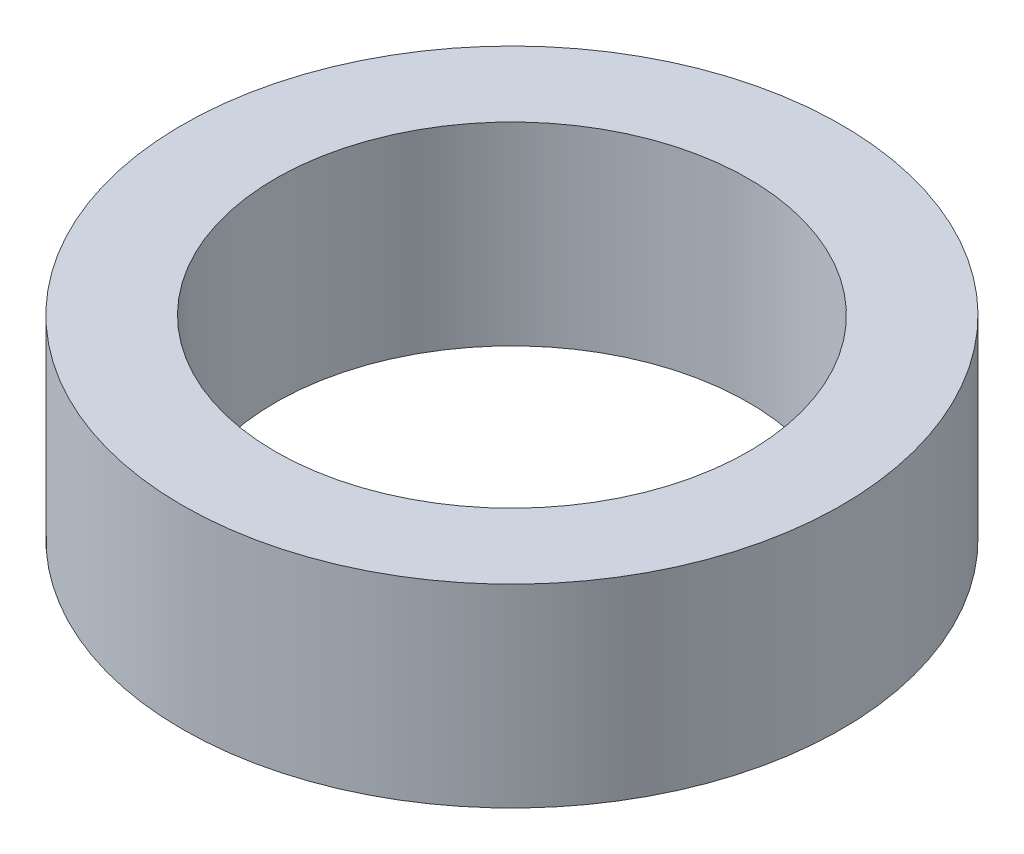
ISO-10303-21;
HEADER;
FILE_DESCRIPTION(('STEP AP214'),'2;1');
FILE_NAME('part.step','',(''),(''),'','','');
FILE_SCHEMA(('AUTOMOTIVE_DESIGN { 1 0 10303 214 1 1 1 1 }'));
ENDSEC;
DATA;
#1=APPLICATION_CONTEXT('core data for automotive mechanical design processes');
#2=APPLICATION_PROTOCOL_DEFINITION('international standard','automotive_design',2000,#1);
#3=PRODUCT_CONTEXT('',#1,'mechanical');
#4=PRODUCT('Part','Part','',(#3));
#5=PRODUCT_RELATED_PRODUCT_CATEGORY('part','',(#4));
#6=PRODUCT_DEFINITION_FORMATION('','',#4);
#7=PRODUCT_DEFINITION_CONTEXT('part definition',#1,'design');
#8=PRODUCT_DEFINITION('design','',#6,#7);
#9=PRODUCT_DEFINITION_SHAPE('','',#8);
#10=(LENGTH_UNIT() NAMED_UNIT(*) SI_UNIT(.MILLI.,.METRE.));
#11=(NAMED_UNIT(*) PLANE_ANGLE_UNIT() SI_UNIT($,.RADIAN.));
#12=(NAMED_UNIT(*) SI_UNIT($,.STERADIAN.) SOLID_ANGLE_UNIT());
#13=UNCERTAINTY_MEASURE_WITH_UNIT(LENGTH_MEASURE(1.E-05),#10,'distance_accuracy_value','');
#14=(GEOMETRIC_REPRESENTATION_CONTEXT(3) GLOBAL_UNCERTAINTY_ASSIGNED_CONTEXT((#13)) GLOBAL_UNIT_ASSIGNED_CONTEXT((#10,
#11,#12)) REPRESENTATION_CONTEXT('',''));
#15=CARTESIAN_POINT('',(0.,0.,0.));
#16=DIRECTION('',(0.,0.,1.));
#17=DIRECTION('',(1.,0.,0.));
#18=AXIS2_PLACEMENT_3D('',#15,#16,#17);
#19=CARTESIAN_POINT('',(-56.2916512459885,-144.,0.));
#20=DIRECTION('',(0.,1.,0.));
#21=DIRECTION('',(0.,0.,1.));
#22=AXIS2_PLACEMENT_3D('',#19,#20,#21);
#23=PLANE('',#22);
#24=CARTESIAN_POINT('',(-56.2916512459885,-144.,0.));
#25=DIRECTION('',(0.,1.,0.));
#26=DIRECTION('',(0.,0.,1.));
#27=AXIS2_PLACEMENT_3D('',#24,#25,#26);
#28=CIRCLE('',#27,8.5);
#29=CARTESIAN_POINT('',(-56.2916512459885,-144.,8.5));
#30=VERTEX_POINT('',#29);
#31=EDGE_CURVE('E10',#30,#30,#28,.T.);
#32=ORIENTED_EDGE('',*,*,#31,.T.);
#33=EDGE_LOOP('',(#32));
#34=FACE_BOUND('',#33,.T.);
#35=CARTESIAN_POINT('',(-56.2916512459885,-144.,0.));
#36=DIRECTION('',(0.,1.,0.));
#37=DIRECTION('',(0.,0.,1.));
#38=AXIS2_PLACEMENT_3D('',#35,#36,#37);
#39=CIRCLE('',#38,6.1);
#40=CARTESIAN_POINT('',(-56.2916512459885,-144.,6.1));
#41=VERTEX_POINT('',#40);
#42=EDGE_CURVE('E49',#41,#41,#39,.T.);
#43=ORIENTED_EDGE('',*,*,#42,.F.);
#44=EDGE_LOOP('',(#43));
#45=FACE_BOUND('',#44,.T.);
#46=ADVANCED_FACE('F39',(#34,#45),#23,.T.);
#47=CARTESIAN_POINT('',(-56.2916512459885,-149.,0.));
#48=DIRECTION('',(0.,1.,0.));
#49=DIRECTION('',(0.,0.,1.));
#50=AXIS2_PLACEMENT_3D('',#47,#48,#49);
#51=PLANE('',#50);
#52=CARTESIAN_POINT('',(-56.2916512459885,-149.,0.));
#53=DIRECTION('',(0.,1.,0.));
#54=DIRECTION('',(0.,0.,1.));
#55=AXIS2_PLACEMENT_3D('',#52,#53,#54);
#56=CIRCLE('',#55,8.5);
#57=CARTESIAN_POINT('',(-56.2916512459885,-149.,8.5));
#58=VERTEX_POINT('',#57);
#59=EDGE_CURVE('E43',#58,#58,#56,.T.);
#60=ORIENTED_EDGE('',*,*,#59,.F.);
#61=EDGE_LOOP('',(#60));
#62=FACE_BOUND('',#61,.T.);
#63=CARTESIAN_POINT('',(-56.2916512459885,-149.,0.));
#64=DIRECTION('',(0.,1.,0.));
#65=DIRECTION('',(0.,0.,1.));
#66=AXIS2_PLACEMENT_3D('',#63,#64,#65);
#67=CIRCLE('',#66,6.1);
#68=CARTESIAN_POINT('',(-56.2916512459885,-149.,6.1));
#69=VERTEX_POINT('',#68);
#70=EDGE_CURVE('E55',#69,#69,#67,.T.);
#71=ORIENTED_EDGE('',*,*,#70,.T.);
#72=EDGE_LOOP('',(#71));
#73=FACE_BOUND('',#72,.T.);
#74=ADVANCED_FACE('F61',(#62,#73),#51,.F.);
#75=CARTESIAN_POINT('',(-56.2916512459885,-144.,0.));
#76=DIRECTION('',(0.,-1.,0.));
#77=DIRECTION('',(0.,0.,-1.));
#78=AXIS2_PLACEMENT_3D('',#75,#76,#77);
#79=CYLINDRICAL_SURFACE('',#78,8.5);
#80=ORIENTED_EDGE('',*,*,#31,.F.);
#81=EDGE_LOOP('',(#80));
#82=FACE_BOUND('',#81,.T.);
#83=ORIENTED_EDGE('',*,*,#59,.T.);
#84=EDGE_LOOP('',(#83));
#85=FACE_BOUND('',#84,.T.);
#86=ADVANCED_FACE('F41',(#82,#85),#79,.T.);
#87=CARTESIAN_POINT('',(-56.2916512459885,-144.,0.));
#88=DIRECTION('',(0.,-1.,0.));
#89=DIRECTION('',(0.,0.,-1.));
#90=AXIS2_PLACEMENT_3D('',#87,#88,#89);
#91=CYLINDRICAL_SURFACE('',#90,6.1);
#92=ORIENTED_EDGE('',*,*,#42,.T.);
#93=EDGE_LOOP('',(#92));
#94=FACE_BOUND('',#93,.T.);
#95=ORIENTED_EDGE('',*,*,#70,.F.);
#96=EDGE_LOOP('',(#95));
#97=FACE_BOUND('',#96,.T.);
#98=ADVANCED_FACE('F59',(#94,#97),#91,.F.);
#99=CLOSED_SHELL('',(#46,#74,#86,#98));
#100=MANIFOLD_SOLID_BREP('B2',#99);
#101=ADVANCED_BREP_SHAPE_REPRESENTATION('',(#18,#100),#14);
#102=SHAPE_DEFINITION_REPRESENTATION(#9,#101);
ENDSEC;
END-ISO-10303-21;
